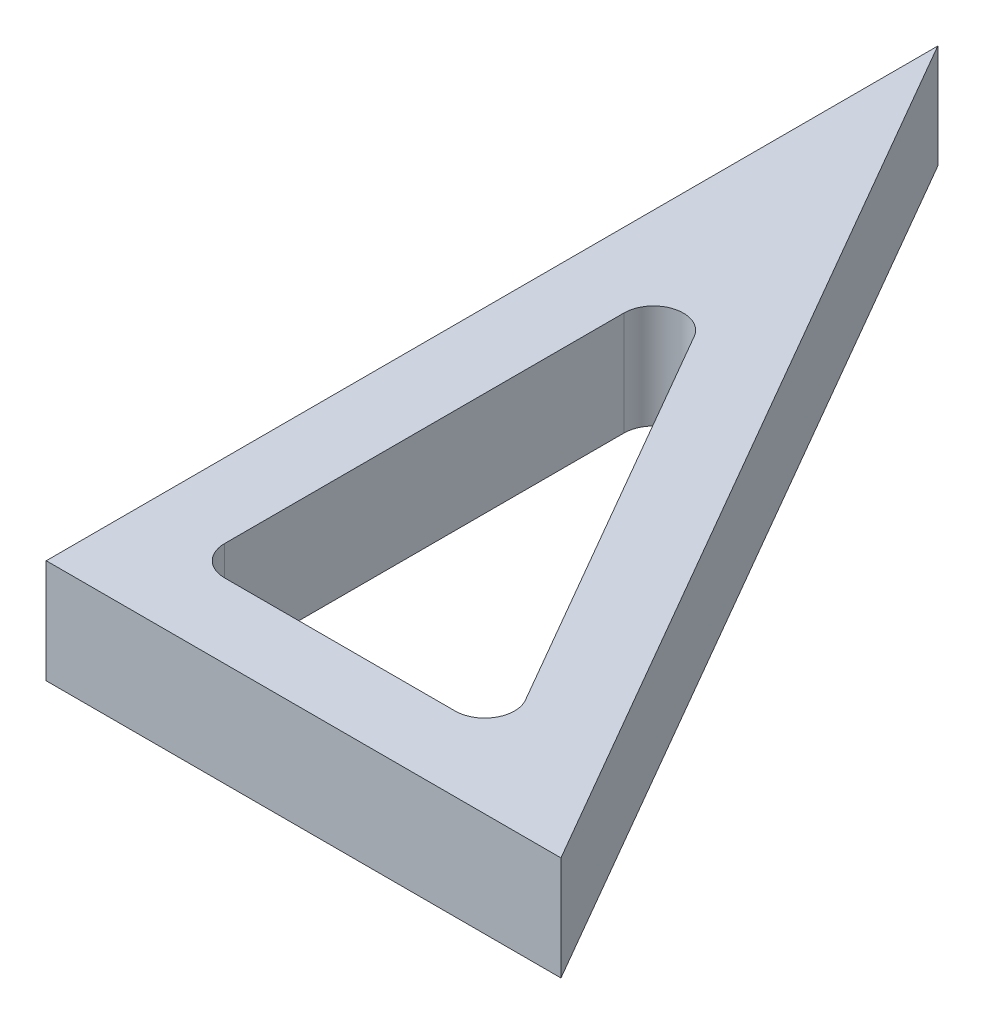
ISO-10303-21;
HEADER;
FILE_DESCRIPTION(('STEP AP214'),'2;1');
FILE_NAME('part.step','',(''),(''),'','','');
FILE_SCHEMA(('AUTOMOTIVE_DESIGN { 1 0 10303 214 1 1 1 1 }'));
ENDSEC;
DATA;
#1=APPLICATION_CONTEXT('core data for automotive mechanical design processes');
#2=APPLICATION_PROTOCOL_DEFINITION('international standard','automotive_design',2000,#1);
#3=PRODUCT_CONTEXT('',#1,'mechanical');
#4=PRODUCT('Part','Part','',(#3));
#5=PRODUCT_RELATED_PRODUCT_CATEGORY('part','',(#4));
#6=PRODUCT_DEFINITION_FORMATION('','',#4);
#7=PRODUCT_DEFINITION_CONTEXT('part definition',#1,'design');
#8=PRODUCT_DEFINITION('design','',#6,#7);
#9=PRODUCT_DEFINITION_SHAPE('','',#8);
#10=(LENGTH_UNIT() NAMED_UNIT(*) SI_UNIT(.MILLI.,.METRE.));
#11=(NAMED_UNIT(*) PLANE_ANGLE_UNIT() SI_UNIT($,.RADIAN.));
#12=(NAMED_UNIT(*) SI_UNIT($,.STERADIAN.) SOLID_ANGLE_UNIT());
#13=UNCERTAINTY_MEASURE_WITH_UNIT(LENGTH_MEASURE(1.E-05),#10,'distance_accuracy_value','');
#14=(GEOMETRIC_REPRESENTATION_CONTEXT(3) GLOBAL_UNCERTAINTY_ASSIGNED_CONTEXT((#13)) GLOBAL_UNIT_ASSIGNED_CONTEXT((#10,
#11,#12)) REPRESENTATION_CONTEXT('',''));
#15=CARTESIAN_POINT('',(0.,0.,0.));
#16=DIRECTION('',(0.,0.,1.));
#17=DIRECTION('',(1.,0.,0.));
#18=AXIS2_PLACEMENT_3D('',#15,#16,#17);
#19=CARTESIAN_POINT('',(0.,7.,0.));
#20=DIRECTION('',(0.,1.,0.));
#21=DIRECTION('',(0.,0.,1.));
#22=AXIS2_PLACEMENT_3D('',#19,#20,#21);
#23=PLANE('',#22);
#24=DIRECTION('',(1.,0.,0.));
#25=VECTOR('',#24,1.);
#26=CARTESIAN_POINT('',(0.,7.,0.));
#27=LINE('',#26,#25);
#28=CARTESIAN_POINT('',(0.,7.,0.));
#29=VERTEX_POINT('',#28);
#30=CARTESIAN_POINT('',(34.6410161513774,7.,0.));
#31=VERTEX_POINT('',#30);
#32=EDGE_CURVE('E162',#29,#31,#27,.T.);
#33=ORIENTED_EDGE('',*,*,#32,.T.);
#34=DIRECTION('',(-0.499999999999998,0.,-0.86602540378444));
#35=VECTOR('',#34,1.);
#36=CARTESIAN_POINT('',(0.,7.,-60.));
#37=LINE('',#36,#35);
#38=CARTESIAN_POINT('',(0.,7.,-60.));
#39=VERTEX_POINT('',#38);
#40=EDGE_CURVE('E161',#31,#39,#37,.T.);
#41=ORIENTED_EDGE('',*,*,#40,.T.);
#42=DIRECTION('',(0.,0.,1.));
#43=VECTOR('',#42,1.);
#44=CARTESIAN_POINT('',(0.,7.,0.));
#45=LINE('',#44,#43);
#46=EDGE_CURVE('E167',#39,#29,#45,.T.);
#47=ORIENTED_EDGE('',*,*,#46,.T.);
#48=EDGE_LOOP('',(#33,#41,#47));
#49=FACE_BOUND('',#48,.T.);
#50=DIRECTION('',(0.,0.,1.));
#51=VECTOR('',#50,1.);
#52=CARTESIAN_POINT('',(5.,7.,-7.00000000000001));
#53=LINE('',#52,#51);
#54=CARTESIAN_POINT('',(5.,7.,-33.8756443470178));
#55=VERTEX_POINT('',#54);
#56=CARTESIAN_POINT('',(5.,7.,-7.00000000000001));
#57=VERTEX_POINT('',#56);
#58=EDGE_CURVE('E120',#55,#57,#53,.T.);
#59=ORIENTED_EDGE('',*,*,#58,.F.);
#60=CARTESIAN_POINT('',(7.,7.,-33.8756443470179));
#61=DIRECTION('',(0.,1.,0.));
#62=DIRECTION('',(0.,0.,1.));
#63=AXIS2_PLACEMENT_3D('',#60,#61,#62);
#64=CIRCLE('',#63,2.);
#65=CARTESIAN_POINT('',(8.73205080756893,7.,-34.8756443470178));
#66=VERTEX_POINT('',#65);
#67=EDGE_CURVE('E108',#66,#55,#64,.T.);
#68=ORIENTED_EDGE('',*,*,#67,.F.);
#69=DIRECTION('',(-0.5,0.,-0.866025403784439));
#70=VECTOR('',#69,1.);
#71=CARTESIAN_POINT('',(8.73205080756893,7.,-34.8756443470178));
#72=LINE('',#71,#70);
#73=CARTESIAN_POINT('',(24.2487113059643,7.,-8.00000000000002));
#74=VERTEX_POINT('',#73);
#75=EDGE_CURVE('E137',#74,#66,#72,.T.);
#76=ORIENTED_EDGE('',*,*,#75,.F.);
#77=CARTESIAN_POINT('',(22.5166604983954,7.,-7.));
#78=DIRECTION('',(0.,1.,0.));
#79=DIRECTION('',(0.,0.,-1.));
#80=AXIS2_PLACEMENT_3D('',#77,#78,#79);
#81=CIRCLE('',#80,2.);
#82=CARTESIAN_POINT('',(22.5166604983954,7.,-5.));
#83=VERTEX_POINT('',#82);
#84=EDGE_CURVE('E140',#83,#74,#81,.T.);
#85=ORIENTED_EDGE('',*,*,#84,.F.);
#86=DIRECTION('',(1.,0.,0.));
#87=VECTOR('',#86,1.);
#88=CARTESIAN_POINT('',(7.00000000000002,7.,-5.));
#89=LINE('',#88,#87);
#90=CARTESIAN_POINT('',(7.00000000000002,7.,-5.));
#91=VERTEX_POINT('',#90);
#92=EDGE_CURVE('E133',#91,#83,#89,.T.);
#93=ORIENTED_EDGE('',*,*,#92,.F.);
#94=CARTESIAN_POINT('',(7.,7.,-7.));
#95=DIRECTION('',(0.,1.,0.));
#96=DIRECTION('',(0.,0.,1.));
#97=AXIS2_PLACEMENT_3D('',#94,#95,#96);
#98=CIRCLE('',#97,2.);
#99=EDGE_CURVE('E131',#57,#91,#98,.T.);
#100=ORIENTED_EDGE('',*,*,#99,.F.);
#101=EDGE_LOOP('',(#59,#68,#76,#85,#93,#100));
#102=FACE_BOUND('',#101,.T.);
#103=ADVANCED_FACE('F39',(#49,#102),#23,.T.);
#104=CARTESIAN_POINT('',(0.,0.,0.));
#105=DIRECTION('',(0.,1.,0.));
#106=DIRECTION('',(0.,0.,1.));
#107=AXIS2_PLACEMENT_3D('',#104,#105,#106);
#108=PLANE('',#107);
#109=DIRECTION('',(1.,0.,0.));
#110=VECTOR('',#109,1.);
#111=CARTESIAN_POINT('',(0.,0.,0.));
#112=LINE('',#111,#110);
#113=CARTESIAN_POINT('',(0.,0.,0.));
#114=VERTEX_POINT('',#113);
#115=CARTESIAN_POINT('',(34.6410161513774,0.,0.));
#116=VERTEX_POINT('',#115);
#117=EDGE_CURVE('E128',#114,#116,#112,.T.);
#118=ORIENTED_EDGE('',*,*,#117,.F.);
#119=DIRECTION('',(0.,0.,1.));
#120=VECTOR('',#119,1.);
#121=CARTESIAN_POINT('',(0.,0.,0.));
#122=LINE('',#121,#120);
#123=CARTESIAN_POINT('',(0.,0.,-60.));
#124=VERTEX_POINT('',#123);
#125=EDGE_CURVE('E163',#124,#114,#122,.T.);
#126=ORIENTED_EDGE('',*,*,#125,.F.);
#127=DIRECTION('',(-0.499999999999998,0.,-0.86602540378444));
#128=VECTOR('',#127,1.);
#129=CARTESIAN_POINT('',(0.,0.,-60.));
#130=LINE('',#129,#128);
#131=EDGE_CURVE('E175',#116,#124,#130,.T.);
#132=ORIENTED_EDGE('',*,*,#131,.F.);
#133=EDGE_LOOP('',(#118,#126,#132));
#134=FACE_BOUND('',#133,.T.);
#135=CARTESIAN_POINT('',(7.,0.,-33.8756443470179));
#136=DIRECTION('',(0.,1.,0.));
#137=DIRECTION('',(0.,0.,1.));
#138=AXIS2_PLACEMENT_3D('',#135,#136,#137);
#139=CIRCLE('',#138,2.);
#140=CARTESIAN_POINT('',(8.73205080756892,0.,-34.8756443470178));
#141=VERTEX_POINT('',#140);
#142=CARTESIAN_POINT('',(5.,0.,-33.8756443470178));
#143=VERTEX_POINT('',#142);
#144=EDGE_CURVE('E64',#141,#143,#139,.T.);
#145=ORIENTED_EDGE('',*,*,#144,.T.);
#146=DIRECTION('',(0.,0.,1.));
#147=VECTOR('',#146,1.);
#148=CARTESIAN_POINT('',(5.,0.,-7.00000000000001));
#149=LINE('',#148,#147);
#150=CARTESIAN_POINT('',(5.,0.,-7.00000000000001));
#151=VERTEX_POINT('',#150);
#152=EDGE_CURVE('E124',#143,#151,#149,.T.);
#153=ORIENTED_EDGE('',*,*,#152,.T.);
#154=CARTESIAN_POINT('',(7.,0.,-7.));
#155=DIRECTION('',(0.,1.,0.));
#156=DIRECTION('',(0.,0.,1.));
#157=AXIS2_PLACEMENT_3D('',#154,#155,#156);
#158=CIRCLE('',#157,2.);
#159=CARTESIAN_POINT('',(7.00000000000002,0.,-5.));
#160=VERTEX_POINT('',#159);
#161=EDGE_CURVE('E142',#151,#160,#158,.T.);
#162=ORIENTED_EDGE('',*,*,#161,.T.);
#163=DIRECTION('',(1.,0.,0.));
#164=VECTOR('',#163,1.);
#165=CARTESIAN_POINT('',(7.00000000000002,0.,-5.));
#166=LINE('',#165,#164);
#167=CARTESIAN_POINT('',(22.5166604983954,0.,-5.));
#168=VERTEX_POINT('',#167);
#169=EDGE_CURVE('E147',#160,#168,#166,.T.);
#170=ORIENTED_EDGE('',*,*,#169,.T.);
#171=CARTESIAN_POINT('',(22.5166604983954,0.,-7.));
#172=DIRECTION('',(0.,1.,0.));
#173=DIRECTION('',(0.,0.,-1.));
#174=AXIS2_PLACEMENT_3D('',#171,#172,#173);
#175=CIRCLE('',#174,2.);
#176=CARTESIAN_POINT('',(24.2487113059643,0.,-8.00000000000002));
#177=VERTEX_POINT('',#176);
#178=EDGE_CURVE('E146',#168,#177,#175,.T.);
#179=ORIENTED_EDGE('',*,*,#178,.T.);
#180=DIRECTION('',(-0.5,0.,-0.866025403784439));
#181=VECTOR('',#180,1.);
#182=CARTESIAN_POINT('',(8.73205080756893,0.,-34.8756443470178));
#183=LINE('',#182,#181);
#184=EDGE_CURVE('E116',#177,#141,#183,.T.);
#185=ORIENTED_EDGE('',*,*,#184,.T.);
#186=EDGE_LOOP('',(#145,#153,#162,#170,#179,#185));
#187=FACE_BOUND('',#186,.T.);
#188=ADVANCED_FACE('F186',(#134,#187),#108,.F.);
#189=CARTESIAN_POINT('',(0.,7.,0.));
#190=DIRECTION('',(0.,0.,-1.));
#191=DIRECTION('',(-1.,0.,0.));
#192=AXIS2_PLACEMENT_3D('',#189,#190,#191);
#193=PLANE('',#192);
#194=ORIENTED_EDGE('',*,*,#117,.T.);
#195=DIRECTION('',(0.,-1.,0.));
#196=VECTOR('',#195,1.);
#197=CARTESIAN_POINT('',(34.6410161513774,7.,0.));
#198=LINE('',#197,#196);
#199=EDGE_CURVE('E11',#31,#116,#198,.T.);
#200=ORIENTED_EDGE('',*,*,#199,.F.);
#201=ORIENTED_EDGE('',*,*,#32,.F.);
#202=DIRECTION('',(0.,-1.,0.));
#203=VECTOR('',#202,1.);
#204=CARTESIAN_POINT('',(0.,7.,0.));
#205=LINE('',#204,#203);
#206=EDGE_CURVE('E170',#29,#114,#205,.T.);
#207=ORIENTED_EDGE('',*,*,#206,.T.);
#208=EDGE_LOOP('',(#194,#200,#201,#207));
#209=FACE_BOUND('',#208,.T.);
#210=ADVANCED_FACE('F41',(#209),#193,.F.);
#211=CARTESIAN_POINT('',(0.,7.,-60.));
#212=DIRECTION('',(-0.86602540378444,0.,0.499999999999998));
#213=DIRECTION('',(0.499999999999998,0.,0.86602540378444));
#214=AXIS2_PLACEMENT_3D('',#211,#212,#213);
#215=PLANE('',#214);
#216=ORIENTED_EDGE('',*,*,#131,.T.);
#217=DIRECTION('',(0.,-1.,0.));
#218=VECTOR('',#217,1.);
#219=CARTESIAN_POINT('',(0.,7.,-60.));
#220=LINE('',#219,#218);
#221=EDGE_CURVE('E50',#39,#124,#220,.T.);
#222=ORIENTED_EDGE('',*,*,#221,.F.);
#223=ORIENTED_EDGE('',*,*,#40,.F.);
#224=ORIENTED_EDGE('',*,*,#199,.T.);
#225=EDGE_LOOP('',(#216,#222,#223,#224));
#226=FACE_BOUND('',#225,.T.);
#227=ADVANCED_FACE('F195',(#226),#215,.F.);
#228=CARTESIAN_POINT('',(0.,7.,0.));
#229=DIRECTION('',(1.,0.,0.));
#230=DIRECTION('',(0.,0.,-1.));
#231=AXIS2_PLACEMENT_3D('',#228,#229,#230);
#232=PLANE('',#231);
#233=ORIENTED_EDGE('',*,*,#125,.T.);
#234=ORIENTED_EDGE('',*,*,#206,.F.);
#235=ORIENTED_EDGE('',*,*,#46,.F.);
#236=ORIENTED_EDGE('',*,*,#221,.T.);
#237=EDGE_LOOP('',(#233,#234,#235,#236));
#238=FACE_BOUND('',#237,.T.);
#239=ADVANCED_FACE('F181',(#238),#232,.F.);
#240=CARTESIAN_POINT('',(7.,7.,-33.8756443470179));
#241=DIRECTION('',(0.,-1.,0.));
#242=DIRECTION('',(0.,0.,-1.));
#243=AXIS2_PLACEMENT_3D('',#240,#241,#242);
#244=CYLINDRICAL_SURFACE('',#243,2.);
#245=ORIENTED_EDGE('',*,*,#144,.F.);
#246=DIRECTION('',(0.,-1.,0.));
#247=VECTOR('',#246,1.);
#248=CARTESIAN_POINT('',(8.73205080756893,7.,-34.8756443470178));
#249=LINE('',#248,#247);
#250=EDGE_CURVE('E114',#66,#141,#249,.T.);
#251=ORIENTED_EDGE('',*,*,#250,.F.);
#252=ORIENTED_EDGE('',*,*,#67,.T.);
#253=DIRECTION('',(0.,-1.,0.));
#254=VECTOR('',#253,1.);
#255=CARTESIAN_POINT('',(5.,7.,-33.8756443470178));
#256=LINE('',#255,#254);
#257=EDGE_CURVE('E111',#55,#143,#256,.T.);
#258=ORIENTED_EDGE('',*,*,#257,.T.);
#259=EDGE_LOOP('',(#245,#251,#252,#258));
#260=FACE_BOUND('',#259,.T.);
#261=ADVANCED_FACE('F115',(#260),#244,.F.);
#262=CARTESIAN_POINT('',(5.,7.,-7.00000000000001));
#263=DIRECTION('',(1.,0.,0.));
#264=DIRECTION('',(0.,0.,-1.));
#265=AXIS2_PLACEMENT_3D('',#262,#263,#264);
#266=PLANE('',#265);
#267=ORIENTED_EDGE('',*,*,#152,.F.);
#268=ORIENTED_EDGE('',*,*,#257,.F.);
#269=ORIENTED_EDGE('',*,*,#58,.T.);
#270=DIRECTION('',(0.,-1.,0.));
#271=VECTOR('',#270,1.);
#272=CARTESIAN_POINT('',(5.,7.,-7.00000000000001));
#273=LINE('',#272,#271);
#274=EDGE_CURVE('E130',#57,#151,#273,.T.);
#275=ORIENTED_EDGE('',*,*,#274,.T.);
#276=EDGE_LOOP('',(#267,#268,#269,#275));
#277=FACE_BOUND('',#276,.T.);
#278=ADVANCED_FACE('F122',(#277),#266,.T.);
#279=CARTESIAN_POINT('',(7.,7.,-7.));
#280=DIRECTION('',(0.,-1.,0.));
#281=DIRECTION('',(0.,0.,-1.));
#282=AXIS2_PLACEMENT_3D('',#279,#280,#281);
#283=CYLINDRICAL_SURFACE('',#282,2.);
#284=ORIENTED_EDGE('',*,*,#161,.F.);
#285=ORIENTED_EDGE('',*,*,#274,.F.);
#286=ORIENTED_EDGE('',*,*,#99,.T.);
#287=DIRECTION('',(0.,-1.,0.));
#288=VECTOR('',#287,1.);
#289=CARTESIAN_POINT('',(7.00000000000002,7.,-5.));
#290=LINE('',#289,#288);
#291=EDGE_CURVE('E156',#91,#160,#290,.T.);
#292=ORIENTED_EDGE('',*,*,#291,.T.);
#293=EDGE_LOOP('',(#284,#285,#286,#292));
#294=FACE_BOUND('',#293,.T.);
#295=ADVANCED_FACE('F208',(#294),#283,.F.);
#296=CARTESIAN_POINT('',(7.00000000000002,7.,-5.));
#297=DIRECTION('',(0.,0.,-1.));
#298=DIRECTION('',(-1.,0.,0.));
#299=AXIS2_PLACEMENT_3D('',#296,#297,#298);
#300=PLANE('',#299);
#301=ORIENTED_EDGE('',*,*,#169,.F.);
#302=ORIENTED_EDGE('',*,*,#291,.F.);
#303=ORIENTED_EDGE('',*,*,#92,.T.);
#304=DIRECTION('',(0.,-1.,0.));
#305=VECTOR('',#304,1.);
#306=CARTESIAN_POINT('',(22.5166604983954,7.,-5.));
#307=LINE('',#306,#305);
#308=EDGE_CURVE('E157',#83,#168,#307,.T.);
#309=ORIENTED_EDGE('',*,*,#308,.T.);
#310=EDGE_LOOP('',(#301,#302,#303,#309));
#311=FACE_BOUND('',#310,.T.);
#312=ADVANCED_FACE('F211',(#311),#300,.T.);
#313=CARTESIAN_POINT('',(22.5166604983954,7.,-7.));
#314=DIRECTION('',(0.,-1.,0.));
#315=DIRECTION('',(0.,0.,-1.));
#316=AXIS2_PLACEMENT_3D('',#313,#314,#315);
#317=CYLINDRICAL_SURFACE('',#316,2.);
#318=ORIENTED_EDGE('',*,*,#178,.F.);
#319=ORIENTED_EDGE('',*,*,#308,.F.);
#320=ORIENTED_EDGE('',*,*,#84,.T.);
#321=DIRECTION('',(0.,-1.,0.));
#322=VECTOR('',#321,1.);
#323=CARTESIAN_POINT('',(24.2487113059643,7.,-8.00000000000002));
#324=LINE('',#323,#322);
#325=EDGE_CURVE('E53',#74,#177,#324,.T.);
#326=ORIENTED_EDGE('',*,*,#325,.T.);
#327=EDGE_LOOP('',(#318,#319,#320,#326));
#328=FACE_BOUND('',#327,.T.);
#329=ADVANCED_FACE('F220',(#328),#317,.F.);
#330=CARTESIAN_POINT('',(8.73205080756893,7.,-34.8756443470178));
#331=DIRECTION('',(-0.866025403784439,0.,0.5));
#332=DIRECTION('',(0.5,0.,0.866025403784439));
#333=AXIS2_PLACEMENT_3D('',#330,#331,#332);
#334=PLANE('',#333);
#335=ORIENTED_EDGE('',*,*,#184,.F.);
#336=ORIENTED_EDGE('',*,*,#325,.F.);
#337=ORIENTED_EDGE('',*,*,#75,.T.);
#338=ORIENTED_EDGE('',*,*,#250,.T.);
#339=EDGE_LOOP('',(#335,#336,#337,#338));
#340=FACE_BOUND('',#339,.T.);
#341=ADVANCED_FACE('F221',(#340),#334,.T.);
#342=CLOSED_SHELL('',(#103,#188,#210,#227,#239,#261,#278,#295,#312,#329,#341));
#343=MANIFOLD_SOLID_BREP('B2',#342);
#344=ADVANCED_BREP_SHAPE_REPRESENTATION('',(#18,#343),#14);
#345=SHAPE_DEFINITION_REPRESENTATION(#9,#344);
ENDSEC;
END-ISO-10303-21;
